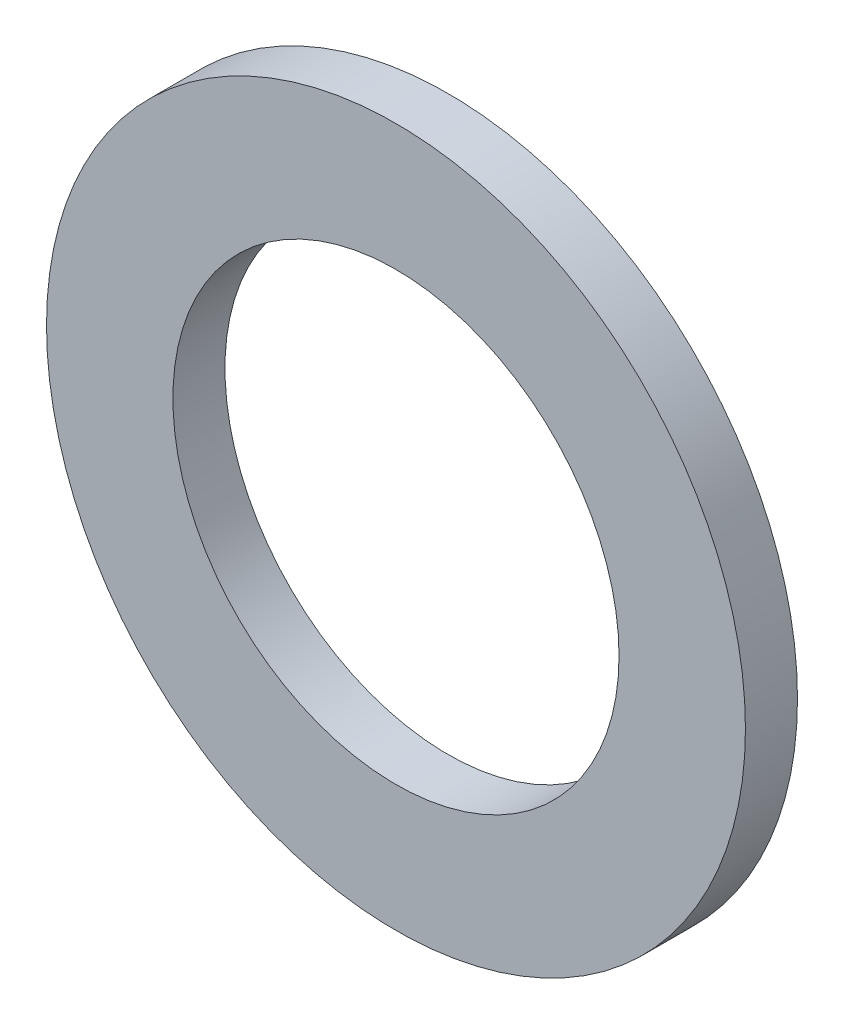
ISO-10303-21;
HEADER;
FILE_DESCRIPTION(('STEP AP214'),'2;1');
FILE_NAME('part.step','',(''),(''),'','','');
FILE_SCHEMA(('AUTOMOTIVE_DESIGN { 1 0 10303 214 1 1 1 1 }'));
ENDSEC;
DATA;
#1=APPLICATION_CONTEXT('core data for automotive mechanical design processes');
#2=APPLICATION_PROTOCOL_DEFINITION('international standard','automotive_design',2000,#1);
#3=PRODUCT_CONTEXT('',#1,'mechanical');
#4=PRODUCT('Part','Part','',(#3));
#5=PRODUCT_RELATED_PRODUCT_CATEGORY('part','',(#4));
#6=PRODUCT_DEFINITION_FORMATION('','',#4);
#7=PRODUCT_DEFINITION_CONTEXT('part definition',#1,'design');
#8=PRODUCT_DEFINITION('design','',#6,#7);
#9=PRODUCT_DEFINITION_SHAPE('','',#8);
#10=(LENGTH_UNIT() NAMED_UNIT(*) SI_UNIT(.MILLI.,.METRE.));
#11=(NAMED_UNIT(*) PLANE_ANGLE_UNIT() SI_UNIT($,.RADIAN.));
#12=(NAMED_UNIT(*) SI_UNIT($,.STERADIAN.) SOLID_ANGLE_UNIT());
#13=UNCERTAINTY_MEASURE_WITH_UNIT(LENGTH_MEASURE(1.E-05),#10,'distance_accuracy_value','');
#14=(GEOMETRIC_REPRESENTATION_CONTEXT(3) GLOBAL_UNCERTAINTY_ASSIGNED_CONTEXT((#13)) GLOBAL_UNIT_ASSIGNED_CONTEXT((#10,
#11,#12)) REPRESENTATION_CONTEXT('',''));
#15=CARTESIAN_POINT('',(0.,0.,0.));
#16=DIRECTION('',(0.,0.,1.));
#17=DIRECTION('',(1.,0.,0.));
#18=AXIS2_PLACEMENT_3D('',#15,#16,#17);
#19=CARTESIAN_POINT('',(0.,0.,-1.));
#20=DIRECTION('',(0.,0.,-1.));
#21=DIRECTION('',(1.,0.,0.));
#22=AXIS2_PLACEMENT_3D('',#19,#20,#21);
#23=CYLINDRICAL_SURFACE('',#22,15.);
#24=CARTESIAN_POINT('',(0.,0.,0.));
#25=DIRECTION('',(0.,0.,-1.));
#26=DIRECTION('',(1.,0.,0.));
#27=AXIS2_PLACEMENT_3D('',#24,#25,#26);
#28=CIRCLE('',#27,15.);
#29=CARTESIAN_POINT('',(15.,0.,0.));
#30=VERTEX_POINT('',#29);
#31=EDGE_CURVE('E58',#30,#30,#28,.T.);
#32=ORIENTED_EDGE('',*,*,#31,.T.);
#33=DIRECTION('',(0.,0.,1.));
#34=VECTOR('',#33,1.);
#35=CARTESIAN_POINT('',(15.,0.,-1.));
#36=LINE('',#35,#34);
#37=CARTESIAN_POINT('',(15.,0.,3.5));
#38=VERTEX_POINT('',#37);
#39=EDGE_CURVE('E9',#30,#38,#36,.T.);
#40=ORIENTED_EDGE('',*,*,#39,.T.);
#41=CARTESIAN_POINT('',(0.,0.,3.5));
#42=DIRECTION('',(0.,0.,-1.));
#43=DIRECTION('',(1.,0.,0.));
#44=AXIS2_PLACEMENT_3D('',#41,#42,#43);
#45=CIRCLE('',#44,15.);
#46=EDGE_CURVE('E23',#38,#38,#45,.T.);
#47=ORIENTED_EDGE('',*,*,#46,.F.);
#48=ORIENTED_EDGE('',*,*,#39,.F.);
#49=EDGE_LOOP('',(#32,#40,#47,#48));
#50=FACE_BOUND('',#49,.T.);
#51=ADVANCED_FACE('F15',(#50),#23,.F.);
#52=CARTESIAN_POINT('',(0.,0.,3.5));
#53=DIRECTION('',(0.,0.,1.));
#54=DIRECTION('',(1.,0.,0.));
#55=AXIS2_PLACEMENT_3D('',#52,#53,#54);
#56=PLANE('',#55);
#57=ORIENTED_EDGE('',*,*,#46,.T.);
#58=EDGE_LOOP('',(#57));
#59=FACE_BOUND('',#58,.T.);
#60=CARTESIAN_POINT('',(0.,0.,3.5));
#61=DIRECTION('',(0.,0.,1.));
#62=DIRECTION('',(1.,0.,0.));
#63=AXIS2_PLACEMENT_3D('',#60,#61,#62);
#64=CIRCLE('',#63,23.5);
#65=CARTESIAN_POINT('',(23.5,0.,3.5));
#66=VERTEX_POINT('',#65);
#67=EDGE_CURVE('E53',#66,#66,#64,.T.);
#68=ORIENTED_EDGE('',*,*,#67,.T.);
#69=EDGE_LOOP('',(#68));
#70=FACE_BOUND('',#69,.T.);
#71=ADVANCED_FACE('F69',(#59,#70),#56,.T.);
#72=CARTESIAN_POINT('',(0.,0.,0.));
#73=DIRECTION('',(0.,0.,1.));
#74=DIRECTION('',(1.,0.,0.));
#75=AXIS2_PLACEMENT_3D('',#72,#73,#74);
#76=PLANE('',#75);
#77=ORIENTED_EDGE('',*,*,#31,.F.);
#78=EDGE_LOOP('',(#77));
#79=FACE_BOUND('',#78,.T.);
#80=CARTESIAN_POINT('',(0.,0.,0.));
#81=DIRECTION('',(0.,0.,1.));
#82=DIRECTION('',(1.,0.,0.));
#83=AXIS2_PLACEMENT_3D('',#80,#81,#82);
#84=CIRCLE('',#83,23.5);
#85=CARTESIAN_POINT('',(23.5,0.,0.));
#86=VERTEX_POINT('',#85);
#87=EDGE_CURVE('E52',#86,#86,#84,.T.);
#88=ORIENTED_EDGE('',*,*,#87,.F.);
#89=EDGE_LOOP('',(#88));
#90=FACE_BOUND('',#89,.T.);
#91=ADVANCED_FACE('F76',(#79,#90),#76,.F.);
#92=CARTESIAN_POINT('',(0.,0.,0.));
#93=DIRECTION('',(0.,0.,-1.));
#94=DIRECTION('',(1.,0.,0.));
#95=AXIS2_PLACEMENT_3D('',#92,#93,#94);
#96=CYLINDRICAL_SURFACE('',#95,23.5);
#97=ORIENTED_EDGE('',*,*,#87,.T.);
#98=DIRECTION('',(0.,0.,1.));
#99=VECTOR('',#98,1.);
#100=CARTESIAN_POINT('',(23.5,0.,0.));
#101=LINE('',#100,#99);
#102=EDGE_CURVE('E49',#86,#66,#101,.T.);
#103=ORIENTED_EDGE('',*,*,#102,.T.);
#104=ORIENTED_EDGE('',*,*,#67,.F.);
#105=ORIENTED_EDGE('',*,*,#102,.F.);
#106=EDGE_LOOP('',(#97,#103,#104,#105));
#107=FACE_BOUND('',#106,.T.);
#108=ADVANCED_FACE('F51',(#107),#96,.T.);
#109=CLOSED_SHELL('',(#51,#71,#91,#108));
#110=MANIFOLD_SOLID_BREP('B1',#109);
#111=ADVANCED_BREP_SHAPE_REPRESENTATION('',(#18,#110),#14);
#112=SHAPE_DEFINITION_REPRESENTATION(#9,#111);
ENDSEC;
END-ISO-10303-21;
